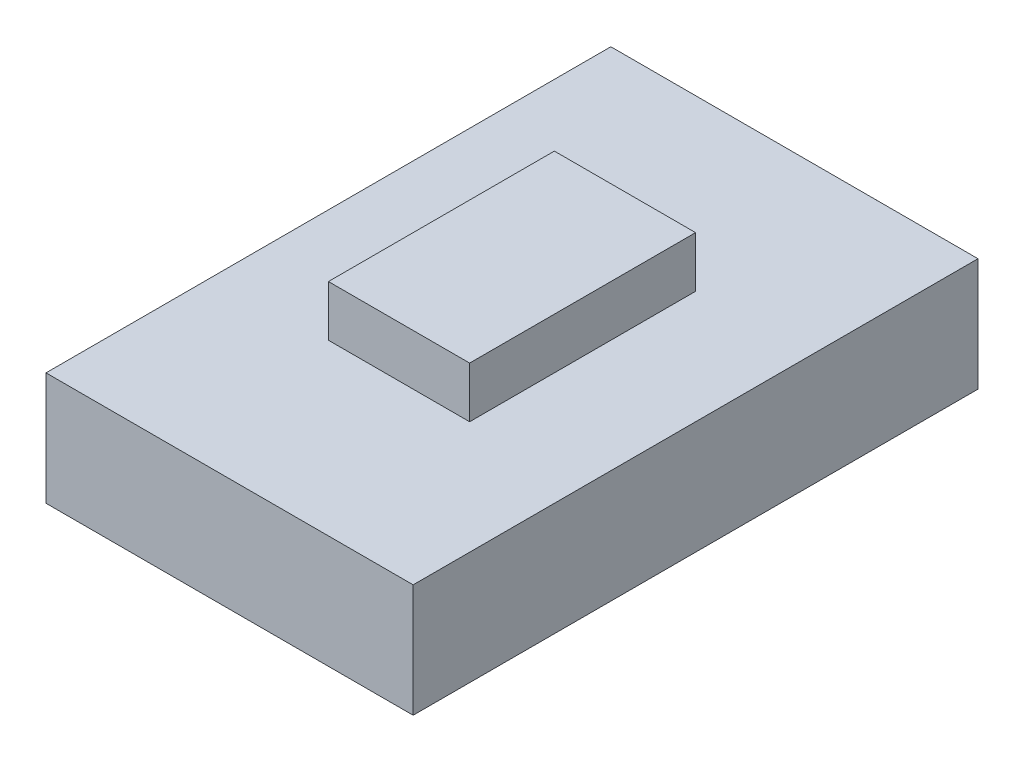
ISO-10303-21;
HEADER;
FILE_DESCRIPTION(('STEP AP214'),'2;1');
FILE_NAME('part.step','',(''),(''),'','','');
FILE_SCHEMA(('AUTOMOTIVE_DESIGN { 1 0 10303 214 1 1 1 1 }'));
ENDSEC;
DATA;
#1=APPLICATION_CONTEXT('core data for automotive mechanical design processes');
#2=APPLICATION_PROTOCOL_DEFINITION('international standard','automotive_design',2000,#1);
#3=PRODUCT_CONTEXT('',#1,'mechanical');
#4=PRODUCT('Part','Part','',(#3));
#5=PRODUCT_RELATED_PRODUCT_CATEGORY('part','',(#4));
#6=PRODUCT_DEFINITION_FORMATION('','',#4);
#7=PRODUCT_DEFINITION_CONTEXT('part definition',#1,'design');
#8=PRODUCT_DEFINITION('design','',#6,#7);
#9=PRODUCT_DEFINITION_SHAPE('','',#8);
#10=(LENGTH_UNIT() NAMED_UNIT(*) SI_UNIT(.MILLI.,.METRE.));
#11=(NAMED_UNIT(*) PLANE_ANGLE_UNIT() SI_UNIT($,.RADIAN.));
#12=(NAMED_UNIT(*) SI_UNIT($,.STERADIAN.) SOLID_ANGLE_UNIT());
#13=UNCERTAINTY_MEASURE_WITH_UNIT(LENGTH_MEASURE(1.E-05),#10,'distance_accuracy_value','');
#14=(GEOMETRIC_REPRESENTATION_CONTEXT(3) GLOBAL_UNCERTAINTY_ASSIGNED_CONTEXT((#13)) GLOBAL_UNIT_ASSIGNED_CONTEXT((#10,
#11,#12)) REPRESENTATION_CONTEXT('',''));
#15=CARTESIAN_POINT('',(0.,0.,0.));
#16=DIRECTION('',(0.,0.,1.));
#17=DIRECTION('',(1.,0.,0.));
#18=AXIS2_PLACEMENT_3D('',#15,#16,#17);
#19=CARTESIAN_POINT('',(1.25,0.45,0.));
#20=DIRECTION('',(0.,0.,-1.));
#21=DIRECTION('',(-1.,0.,0.));
#22=AXIS2_PLACEMENT_3D('',#19,#20,#21);
#23=PLANE('',#22);
#24=DIRECTION('',(1.,0.,0.));
#25=VECTOR('',#24,1.);
#26=CARTESIAN_POINT('',(1.25,0.,0.));
#27=LINE('',#26,#25);
#28=CARTESIAN_POINT('',(0.,0.,0.));
#29=VERTEX_POINT('',#28);
#30=CARTESIAN_POINT('',(1.25,0.,0.));
#31=VERTEX_POINT('',#30);
#32=EDGE_CURVE('E117',#29,#31,#27,.T.);
#33=ORIENTED_EDGE('',*,*,#32,.T.);
#34=DIRECTION('',(0.,-1.,0.));
#35=VECTOR('',#34,1.);
#36=CARTESIAN_POINT('',(1.25,0.45,0.));
#37=LINE('',#36,#35);
#38=CARTESIAN_POINT('',(1.25,0.45,0.));
#39=VERTEX_POINT('',#38);
#40=EDGE_CURVE('E11',#39,#31,#37,.T.);
#41=ORIENTED_EDGE('',*,*,#40,.F.);
#42=DIRECTION('',(1.,0.,0.));
#43=VECTOR('',#42,1.);
#44=CARTESIAN_POINT('',(1.25,0.45,0.));
#45=LINE('',#44,#43);
#46=CARTESIAN_POINT('',(0.,0.45,0.));
#47=VERTEX_POINT('',#46);
#48=EDGE_CURVE('E126',#47,#39,#45,.T.);
#49=ORIENTED_EDGE('',*,*,#48,.F.);
#50=DIRECTION('',(0.,-1.,0.));
#51=VECTOR('',#50,1.);
#52=CARTESIAN_POINT('',(0.,0.45,0.));
#53=LINE('',#52,#51);
#54=EDGE_CURVE('E133',#47,#29,#53,.T.);
#55=ORIENTED_EDGE('',*,*,#54,.T.);
#56=EDGE_LOOP('',(#33,#41,#49,#55));
#57=FACE_BOUND('',#56,.T.);
#58=ADVANCED_FACE('F34',(#57),#23,.F.);
#59=CARTESIAN_POINT('',(1.25,0.45,-2.));
#60=DIRECTION('',(-1.,0.,0.));
#61=DIRECTION('',(0.,0.,1.));
#62=AXIS2_PLACEMENT_3D('',#59,#60,#61);
#63=PLANE('',#62);
#64=DIRECTION('',(0.,0.,-1.));
#65=VECTOR('',#64,1.);
#66=CARTESIAN_POINT('',(1.25,0.,-2.));
#67=LINE('',#66,#65);
#68=CARTESIAN_POINT('',(1.25,0.,-2.));
#69=VERTEX_POINT('',#68);
#70=EDGE_CURVE('E120',#31,#69,#67,.T.);
#71=ORIENTED_EDGE('',*,*,#70,.T.);
#72=DIRECTION('',(0.,-1.,0.));
#73=VECTOR('',#72,1.);
#74=CARTESIAN_POINT('',(1.25,0.45,-2.));
#75=LINE('',#74,#73);
#76=CARTESIAN_POINT('',(1.25,0.45,-2.));
#77=VERTEX_POINT('',#76);
#78=EDGE_CURVE('E42',#77,#69,#75,.T.);
#79=ORIENTED_EDGE('',*,*,#78,.F.);
#80=DIRECTION('',(0.,0.,-1.));
#81=VECTOR('',#80,1.);
#82=CARTESIAN_POINT('',(1.25,0.45,-2.));
#83=LINE('',#82,#81);
#84=EDGE_CURVE('E128',#39,#77,#83,.T.);
#85=ORIENTED_EDGE('',*,*,#84,.F.);
#86=ORIENTED_EDGE('',*,*,#40,.T.);
#87=EDGE_LOOP('',(#71,#79,#85,#86));
#88=FACE_BOUND('',#87,.T.);
#89=ADVANCED_FACE('F154',(#88),#63,.F.);
#90=CARTESIAN_POINT('',(0.,0.45,-2.));
#91=DIRECTION('',(0.,0.,1.));
#92=DIRECTION('',(1.,0.,0.));
#93=AXIS2_PLACEMENT_3D('',#90,#91,#92);
#94=PLANE('',#93);
#95=DIRECTION('',(-1.,0.,0.));
#96=VECTOR('',#95,1.);
#97=CARTESIAN_POINT('',(0.,0.,-2.));
#98=LINE('',#97,#96);
#99=CARTESIAN_POINT('',(0.,0.,-2.));
#100=VERTEX_POINT('',#99);
#101=EDGE_CURVE('E137',#69,#100,#98,.T.);
#102=ORIENTED_EDGE('',*,*,#101,.T.);
#103=DIRECTION('',(0.,-1.,0.));
#104=VECTOR('',#103,1.);
#105=CARTESIAN_POINT('',(0.,0.45,-2.));
#106=LINE('',#105,#104);
#107=CARTESIAN_POINT('',(0.,0.45,-2.));
#108=VERTEX_POINT('',#107);
#109=EDGE_CURVE('E144',#108,#100,#106,.T.);
#110=ORIENTED_EDGE('',*,*,#109,.F.);
#111=DIRECTION('',(-1.,0.,0.));
#112=VECTOR('',#111,1.);
#113=CARTESIAN_POINT('',(0.,0.45,-2.));
#114=LINE('',#113,#112);
#115=EDGE_CURVE('E131',#77,#108,#114,.T.);
#116=ORIENTED_EDGE('',*,*,#115,.F.);
#117=ORIENTED_EDGE('',*,*,#78,.T.);
#118=EDGE_LOOP('',(#102,#110,#116,#117));
#119=FACE_BOUND('',#118,.T.);
#120=ADVANCED_FACE('F150',(#119),#94,.F.);
#121=CARTESIAN_POINT('',(0.,0.45,0.));
#122=DIRECTION('',(1.,0.,0.));
#123=DIRECTION('',(0.,0.,-1.));
#124=AXIS2_PLACEMENT_3D('',#121,#122,#123);
#125=PLANE('',#124);
#126=DIRECTION('',(0.,0.,1.));
#127=VECTOR('',#126,1.);
#128=CARTESIAN_POINT('',(0.,0.,0.));
#129=LINE('',#128,#127);
#130=EDGE_CURVE('E129',#100,#29,#129,.T.);
#131=ORIENTED_EDGE('',*,*,#130,.T.);
#132=ORIENTED_EDGE('',*,*,#54,.F.);
#133=DIRECTION('',(0.,0.,1.));
#134=VECTOR('',#133,1.);
#135=CARTESIAN_POINT('',(0.,0.45,0.));
#136=LINE('',#135,#134);
#137=EDGE_CURVE('E49',#108,#47,#136,.T.);
#138=ORIENTED_EDGE('',*,*,#137,.F.);
#139=ORIENTED_EDGE('',*,*,#109,.T.);
#140=EDGE_LOOP('',(#131,#132,#138,#139));
#141=FACE_BOUND('',#140,.T.);
#142=ADVANCED_FACE('F160',(#141),#125,.F.);
#143=CARTESIAN_POINT('',(0.,0.45,0.));
#144=DIRECTION('',(0.,-1.,0.));
#145=DIRECTION('',(0.,0.,-1.));
#146=AXIS2_PLACEMENT_3D('',#143,#144,#145);
#147=PLANE('',#146);
#148=ORIENTED_EDGE('',*,*,#48,.T.);
#149=ORIENTED_EDGE('',*,*,#84,.T.);
#150=ORIENTED_EDGE('',*,*,#115,.T.);
#151=ORIENTED_EDGE('',*,*,#137,.T.);
#152=EDGE_LOOP('',(#148,#149,#150,#151));
#153=FACE_BOUND('',#152,.T.);
#154=ADVANCED_FACE('F163',(#153),#147,.F.);
#155=CARTESIAN_POINT('',(2.25,-1.,-3.5));
#156=DIRECTION('',(-1.,0.,0.));
#157=DIRECTION('',(0.,0.,1.));
#158=AXIS2_PLACEMENT_3D('',#155,#156,#157);
#159=PLANE('',#158);
#160=DIRECTION('',(0.,0.,1.));
#161=VECTOR('',#160,1.);
#162=CARTESIAN_POINT('',(2.25,0.,-3.5));
#163=LINE('',#162,#161);
#164=CARTESIAN_POINT('',(2.25,0.,-3.5));
#165=VERTEX_POINT('',#164);
#166=CARTESIAN_POINT('',(2.25,0.,1.5));
#167=VERTEX_POINT('',#166);
#168=EDGE_CURVE('E261',#165,#167,#163,.T.);
#169=ORIENTED_EDGE('',*,*,#168,.T.);
#170=DIRECTION('',(0.,1.,0.));
#171=VECTOR('',#170,1.);
#172=CARTESIAN_POINT('',(2.25,-1.,1.5));
#173=LINE('',#172,#171);
#174=CARTESIAN_POINT('',(2.25,-1.,1.5));
#175=VERTEX_POINT('',#174);
#176=EDGE_CURVE('E100',#175,#167,#173,.T.);
#177=ORIENTED_EDGE('',*,*,#176,.F.);
#178=DIRECTION('',(0.,0.,1.));
#179=VECTOR('',#178,1.);
#180=CARTESIAN_POINT('',(2.25,-1.,-3.5));
#181=LINE('',#180,#179);
#182=CARTESIAN_POINT('',(2.25,-1.,-3.5));
#183=VERTEX_POINT('',#182);
#184=EDGE_CURVE('E94',#183,#175,#181,.T.);
#185=ORIENTED_EDGE('',*,*,#184,.F.);
#186=DIRECTION('',(0.,1.,0.));
#187=VECTOR('',#186,1.);
#188=CARTESIAN_POINT('',(2.25,-1.,-3.5));
#189=LINE('',#188,#187);
#190=EDGE_CURVE('E98',#183,#165,#189,.T.);
#191=ORIENTED_EDGE('',*,*,#190,.T.);
#192=EDGE_LOOP('',(#169,#177,#185,#191));
#193=FACE_BOUND('',#192,.T.);
#194=ADVANCED_FACE('F96',(#193),#159,.F.);
#195=CARTESIAN_POINT('',(2.25,-1.,1.5));
#196=DIRECTION('',(0.,0.,-1.));
#197=DIRECTION('',(-1.,0.,0.));
#198=AXIS2_PLACEMENT_3D('',#195,#196,#197);
#199=PLANE('',#198);
#200=DIRECTION('',(-1.,0.,0.));
#201=VECTOR('',#200,1.);
#202=CARTESIAN_POINT('',(2.25,0.,1.5));
#203=LINE('',#202,#201);
#204=CARTESIAN_POINT('',(-1.,0.,1.5));
#205=VERTEX_POINT('',#204);
#206=EDGE_CURVE('E254',#167,#205,#203,.T.);
#207=ORIENTED_EDGE('',*,*,#206,.T.);
#208=DIRECTION('',(0.,1.,0.));
#209=VECTOR('',#208,1.);
#210=CARTESIAN_POINT('',(-1.,-1.,1.5));
#211=LINE('',#210,#209);
#212=CARTESIAN_POINT('',(-1.,-1.,1.5));
#213=VERTEX_POINT('',#212);
#214=EDGE_CURVE('E122',#213,#205,#211,.T.);
#215=ORIENTED_EDGE('',*,*,#214,.F.);
#216=DIRECTION('',(-1.,0.,0.));
#217=VECTOR('',#216,1.);
#218=CARTESIAN_POINT('',(2.25,-1.,1.5));
#219=LINE('',#218,#217);
#220=EDGE_CURVE('E103',#175,#213,#219,.T.);
#221=ORIENTED_EDGE('',*,*,#220,.F.);
#222=ORIENTED_EDGE('',*,*,#176,.T.);
#223=EDGE_LOOP('',(#207,#215,#221,#222));
#224=FACE_BOUND('',#223,.T.);
#225=ADVANCED_FACE('F170',(#224),#199,.F.);
#226=CARTESIAN_POINT('',(-1.,-1.,1.5));
#227=DIRECTION('',(1.,0.,0.));
#228=DIRECTION('',(0.,0.,-1.));
#229=AXIS2_PLACEMENT_3D('',#226,#227,#228);
#230=PLANE('',#229);
#231=DIRECTION('',(0.,0.,-1.));
#232=VECTOR('',#231,1.);
#233=CARTESIAN_POINT('',(-1.,0.,1.5));
#234=LINE('',#233,#232);
#235=CARTESIAN_POINT('',(-1.,0.,-3.5));
#236=VERTEX_POINT('',#235);
#237=EDGE_CURVE('E250',#205,#236,#234,.T.);
#238=ORIENTED_EDGE('',*,*,#237,.T.);
#239=DIRECTION('',(0.,1.,0.));
#240=VECTOR('',#239,1.);
#241=CARTESIAN_POINT('',(-1.,-1.,-3.5));
#242=LINE('',#241,#240);
#243=CARTESIAN_POINT('',(-1.,-1.,-3.5));
#244=VERTEX_POINT('',#243);
#245=EDGE_CURVE('E251',#244,#236,#242,.T.);
#246=ORIENTED_EDGE('',*,*,#245,.F.);
#247=DIRECTION('',(0.,0.,-1.));
#248=VECTOR('',#247,1.);
#249=CARTESIAN_POINT('',(-1.,-1.,1.5));
#250=LINE('',#249,#248);
#251=EDGE_CURVE('E109',#213,#244,#250,.T.);
#252=ORIENTED_EDGE('',*,*,#251,.F.);
#253=ORIENTED_EDGE('',*,*,#214,.T.);
#254=EDGE_LOOP('',(#238,#246,#252,#253));
#255=FACE_BOUND('',#254,.T.);
#256=ADVANCED_FACE('F203',(#255),#230,.F.);
#257=CARTESIAN_POINT('',(0.560610070231076,-1.,-3.5));
#258=DIRECTION('',(0.,0.,1.));
#259=DIRECTION('',(1.,0.,0.));
#260=AXIS2_PLACEMENT_3D('',#257,#258,#259);
#261=PLANE('',#260);
#262=DIRECTION('',(1.,0.,0.));
#263=VECTOR('',#262,1.);
#264=CARTESIAN_POINT('',(0.560610070231076,0.,-3.5));
#265=LINE('',#264,#263);
#266=EDGE_CURVE('E113',#236,#165,#265,.T.);
#267=ORIENTED_EDGE('',*,*,#266,.T.);
#268=ORIENTED_EDGE('',*,*,#190,.F.);
#269=DIRECTION('',(1.,0.,0.));
#270=VECTOR('',#269,1.);
#271=CARTESIAN_POINT('',(0.625,-1.,-3.5));
#272=LINE('',#271,#270);
#273=EDGE_CURVE('E104',#244,#183,#272,.T.);
#274=ORIENTED_EDGE('',*,*,#273,.F.);
#275=ORIENTED_EDGE('',*,*,#245,.T.);
#276=EDGE_LOOP('',(#267,#268,#274,#275));
#277=FACE_BOUND('',#276,.T.);
#278=ADVANCED_FACE('F115',(#277),#261,.F.);
#279=CARTESIAN_POINT('',(0.,-1.,0.));
#280=DIRECTION('',(0.,-1.,0.));
#281=DIRECTION('',(0.,0.,-1.));
#282=AXIS2_PLACEMENT_3D('',#279,#280,#281);
#283=PLANE('',#282);
#284=ORIENTED_EDGE('',*,*,#273,.T.);
#285=ORIENTED_EDGE('',*,*,#184,.T.);
#286=ORIENTED_EDGE('',*,*,#220,.T.);
#287=ORIENTED_EDGE('',*,*,#251,.T.);
#288=EDGE_LOOP('',(#284,#285,#286,#287));
#289=FACE_BOUND('',#288,.T.);
#290=ADVANCED_FACE('F107',(#289),#283,.T.);
#291=CARTESIAN_POINT('',(0.,0.,0.));
#292=DIRECTION('',(0.,-1.,0.));
#293=DIRECTION('',(0.,0.,-1.));
#294=AXIS2_PLACEMENT_3D('',#291,#292,#293);
#295=PLANE('',#294);
#296=ORIENTED_EDGE('',*,*,#32,.F.);
#297=ORIENTED_EDGE('',*,*,#130,.F.);
#298=ORIENTED_EDGE('',*,*,#101,.F.);
#299=ORIENTED_EDGE('',*,*,#70,.F.);
#300=EDGE_LOOP('',(#296,#297,#298,#299));
#301=FACE_BOUND('',#300,.T.);
#302=ORIENTED_EDGE('',*,*,#168,.F.);
#303=ORIENTED_EDGE('',*,*,#266,.F.);
#304=ORIENTED_EDGE('',*,*,#237,.F.);
#305=ORIENTED_EDGE('',*,*,#206,.F.);
#306=EDGE_LOOP('',(#302,#303,#304,#305));
#307=FACE_BOUND('',#306,.T.);
#308=ADVANCED_FACE('F157',(#301,#307),#295,.F.);
#309=CLOSED_SHELL('',(#58,#89,#120,#142,#154,#194,#225,#256,#278,#290,#308));
#310=MANIFOLD_SOLID_BREP('B2',#309);
#311=ADVANCED_BREP_SHAPE_REPRESENTATION('',(#18,#310),#14);
#312=SHAPE_DEFINITION_REPRESENTATION(#9,#311);
ENDSEC;
END-ISO-10303-21;
